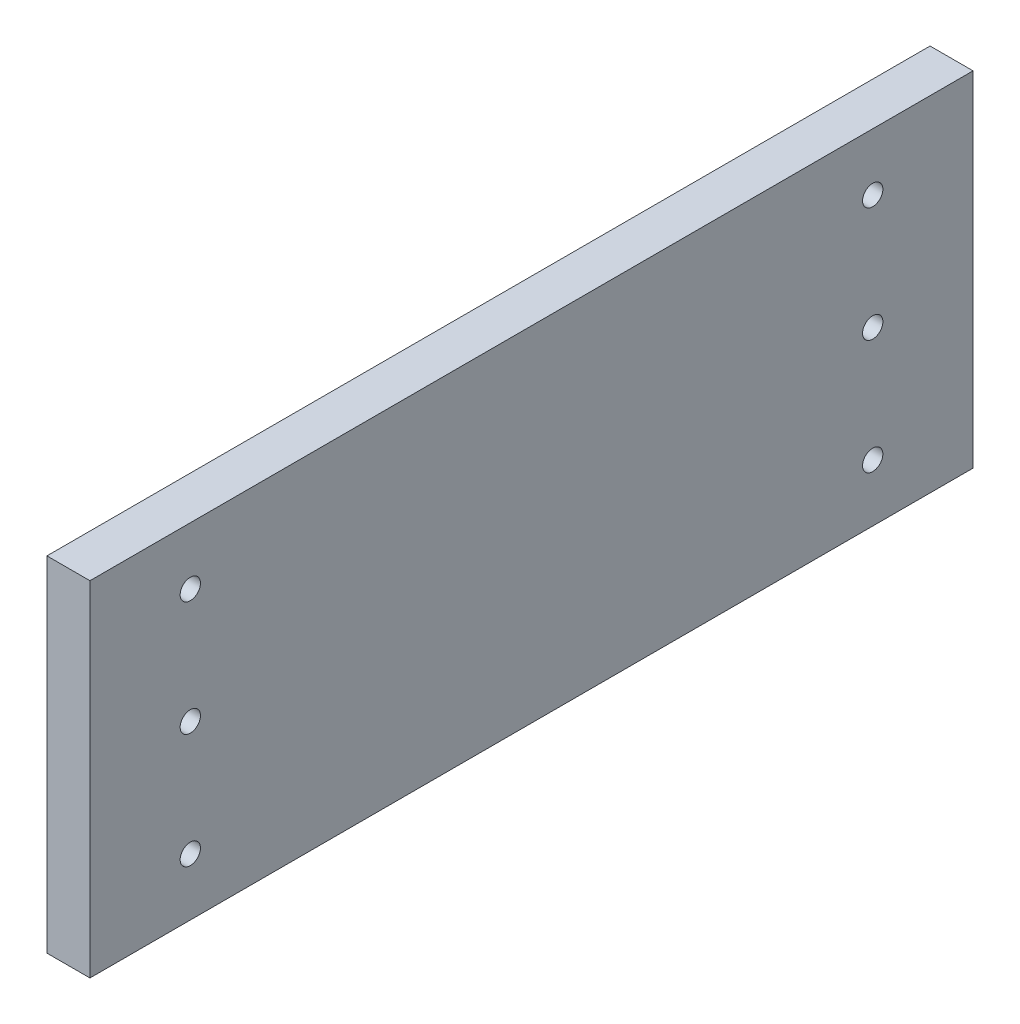
ISO-10303-21;
HEADER;
FILE_DESCRIPTION(('STEP AP214'),'2;1');
FILE_NAME('part.step','',(''),(''),'','','');
FILE_SCHEMA(('AUTOMOTIVE_DESIGN { 1 0 10303 214 1 1 1 1 }'));
ENDSEC;
DATA;
#1=APPLICATION_CONTEXT('core data for automotive mechanical design processes');
#2=APPLICATION_PROTOCOL_DEFINITION('international standard','automotive_design',2000,#1);
#3=PRODUCT_CONTEXT('',#1,'mechanical');
#4=PRODUCT('Part','Part','',(#3));
#5=PRODUCT_RELATED_PRODUCT_CATEGORY('part','',(#4));
#6=PRODUCT_DEFINITION_FORMATION('','',#4);
#7=PRODUCT_DEFINITION_CONTEXT('part definition',#1,'design');
#8=PRODUCT_DEFINITION('design','',#6,#7);
#9=PRODUCT_DEFINITION_SHAPE('','',#8);
#10=(LENGTH_UNIT() NAMED_UNIT(*) SI_UNIT(.MILLI.,.METRE.));
#11=(NAMED_UNIT(*) PLANE_ANGLE_UNIT() SI_UNIT($,.RADIAN.));
#12=(NAMED_UNIT(*) SI_UNIT($,.STERADIAN.) SOLID_ANGLE_UNIT());
#13=UNCERTAINTY_MEASURE_WITH_UNIT(LENGTH_MEASURE(1.E-05),#10,'distance_accuracy_value','');
#14=(GEOMETRIC_REPRESENTATION_CONTEXT(3) GLOBAL_UNCERTAINTY_ASSIGNED_CONTEXT((#13)) GLOBAL_UNIT_ASSIGNED_CONTEXT((#10,
#11,#12)) REPRESENTATION_CONTEXT('',''));
#15=CARTESIAN_POINT('',(0.,0.,0.));
#16=DIRECTION('',(0.,0.,1.));
#17=DIRECTION('',(1.,0.,0.));
#18=AXIS2_PLACEMENT_3D('',#15,#16,#17);
#19=CARTESIAN_POINT('',(4.7625,38.1,195.58));
#20=DIRECTION('',(-1.,0.,0.));
#21=DIRECTION('',(0.,-1.,0.));
#22=AXIS2_PLACEMENT_3D('',#19,#20,#21);
#23=PLANE('',#22);
#24=CARTESIAN_POINT('',(4.7625,25.4,173.355));
#25=DIRECTION('',(1.,0.,0.));
#26=DIRECTION('',(0.,0.,-1.));
#27=AXIS2_PLACEMENT_3D('',#24,#25,#26);
#28=CIRCLE('',#27,2.24789999999999);
#29=CARTESIAN_POINT('',(4.7625,25.4,171.1071));
#30=VERTEX_POINT('',#29);
#31=EDGE_CURVE('E142',#30,#30,#28,.T.);
#32=ORIENTED_EDGE('',*,*,#31,.F.);
#33=EDGE_LOOP('',(#32));
#34=FACE_BOUND('',#33,.T.);
#35=CARTESIAN_POINT('',(4.7625,0.,173.355));
#36=DIRECTION('',(1.,0.,0.));
#37=DIRECTION('',(0.,0.,-1.));
#38=AXIS2_PLACEMENT_3D('',#35,#36,#37);
#39=CIRCLE('',#38,2.24789999999999);
#40=CARTESIAN_POINT('',(4.7625,0.,171.1071));
#41=VERTEX_POINT('',#40);
#42=EDGE_CURVE('E136',#41,#41,#39,.T.);
#43=ORIENTED_EDGE('',*,*,#42,.F.);
#44=EDGE_LOOP('',(#43));
#45=FACE_BOUND('',#44,.T.);
#46=CARTESIAN_POINT('',(4.7625,-25.4,173.355));
#47=DIRECTION('',(1.,0.,0.));
#48=DIRECTION('',(0.,0.,-1.));
#49=AXIS2_PLACEMENT_3D('',#46,#47,#48);
#50=CIRCLE('',#49,2.24789999999999);
#51=CARTESIAN_POINT('',(4.7625,-25.4,171.1071));
#52=VERTEX_POINT('',#51);
#53=EDGE_CURVE('E130',#52,#52,#50,.T.);
#54=ORIENTED_EDGE('',*,*,#53,.F.);
#55=EDGE_LOOP('',(#54));
#56=FACE_BOUND('',#55,.T.);
#57=CARTESIAN_POINT('',(4.7625,25.4,22.225));
#58=DIRECTION('',(1.,0.,0.));
#59=DIRECTION('',(0.,0.,-1.));
#60=AXIS2_PLACEMENT_3D('',#57,#58,#59);
#61=CIRCLE('',#60,2.24789999999999);
#62=CARTESIAN_POINT('',(4.7625,25.4,19.9771));
#63=VERTEX_POINT('',#62);
#64=EDGE_CURVE('E124',#63,#63,#61,.T.);
#65=ORIENTED_EDGE('',*,*,#64,.F.);
#66=EDGE_LOOP('',(#65));
#67=FACE_BOUND('',#66,.T.);
#68=CARTESIAN_POINT('',(4.7625,0.,22.225));
#69=DIRECTION('',(1.,0.,0.));
#70=DIRECTION('',(0.,0.,-1.));
#71=AXIS2_PLACEMENT_3D('',#68,#69,#70);
#72=CIRCLE('',#71,2.24789999999999);
#73=CARTESIAN_POINT('',(4.7625,0.,19.9771));
#74=VERTEX_POINT('',#73);
#75=EDGE_CURVE('E118',#74,#74,#72,.T.);
#76=ORIENTED_EDGE('',*,*,#75,.F.);
#77=EDGE_LOOP('',(#76));
#78=FACE_BOUND('',#77,.T.);
#79=CARTESIAN_POINT('',(4.7625,-25.4,22.225));
#80=DIRECTION('',(1.,0.,0.));
#81=DIRECTION('',(0.,0.,-1.));
#82=AXIS2_PLACEMENT_3D('',#79,#80,#81);
#83=CIRCLE('',#82,2.24789999999999);
#84=CARTESIAN_POINT('',(4.7625,-25.4,19.9771));
#85=VERTEX_POINT('',#84);
#86=EDGE_CURVE('E112',#85,#85,#83,.T.);
#87=ORIENTED_EDGE('',*,*,#86,.F.);
#88=EDGE_LOOP('',(#87));
#89=FACE_BOUND('',#88,.T.);
#90=DIRECTION('',(0.,1.,0.));
#91=VECTOR('',#90,1.);
#92=CARTESIAN_POINT('',(4.7625,38.1,0.));
#93=LINE('',#92,#91);
#94=CARTESIAN_POINT('',(4.7625,-38.1,0.));
#95=VERTEX_POINT('',#94);
#96=CARTESIAN_POINT('',(4.7625,38.1,0.));
#97=VERTEX_POINT('',#96);
#98=EDGE_CURVE('E96',#95,#97,#93,.T.);
#99=ORIENTED_EDGE('',*,*,#98,.T.);
#100=DIRECTION('',(0.,0.,-1.));
#101=VECTOR('',#100,1.);
#102=CARTESIAN_POINT('',(4.7625,38.1,195.58));
#103=LINE('',#102,#101);
#104=CARTESIAN_POINT('',(4.7625,38.1,195.58));
#105=VERTEX_POINT('',#104);
#106=EDGE_CURVE('E11',#105,#97,#103,.T.);
#107=ORIENTED_EDGE('',*,*,#106,.F.);
#108=DIRECTION('',(0.,1.,0.));
#109=VECTOR('',#108,1.);
#110=CARTESIAN_POINT('',(4.7625,38.1,195.58));
#111=LINE('',#110,#109);
#112=CARTESIAN_POINT('',(4.7625,-38.1,195.58));
#113=VERTEX_POINT('',#112);
#114=EDGE_CURVE('E84',#113,#105,#111,.T.);
#115=ORIENTED_EDGE('',*,*,#114,.F.);
#116=DIRECTION('',(0.,0.,-1.));
#117=VECTOR('',#116,1.);
#118=CARTESIAN_POINT('',(4.7625,-38.1,195.58));
#119=LINE('',#118,#117);
#120=EDGE_CURVE('E92',#113,#95,#119,.T.);
#121=ORIENTED_EDGE('',*,*,#120,.T.);
#122=EDGE_LOOP('',(#99,#107,#115,#121));
#123=FACE_BOUND('',#122,.T.);
#124=ADVANCED_FACE('F33',(#34,#45,#56,#67,#78,#89,#123),#23,.F.);
#125=CARTESIAN_POINT('',(-4.7625,38.1,195.58));
#126=DIRECTION('',(0.,-1.,0.));
#127=DIRECTION('',(0.,0.,-1.));
#128=AXIS2_PLACEMENT_3D('',#125,#126,#127);
#129=PLANE('',#128);
#130=DIRECTION('',(-1.,0.,0.));
#131=VECTOR('',#130,1.);
#132=CARTESIAN_POINT('',(-4.7625,38.1,0.));
#133=LINE('',#132,#131);
#134=CARTESIAN_POINT('',(-4.7625,38.1,0.));
#135=VERTEX_POINT('',#134);
#136=EDGE_CURVE('E88',#97,#135,#133,.T.);
#137=ORIENTED_EDGE('',*,*,#136,.T.);
#138=DIRECTION('',(0.,0.,-1.));
#139=VECTOR('',#138,1.);
#140=CARTESIAN_POINT('',(-4.7625,38.1,195.58));
#141=LINE('',#140,#139);
#142=CARTESIAN_POINT('',(-4.7625,38.1,195.58));
#143=VERTEX_POINT('',#142);
#144=EDGE_CURVE('E41',#143,#135,#141,.T.);
#145=ORIENTED_EDGE('',*,*,#144,.F.);
#146=DIRECTION('',(-1.,0.,0.));
#147=VECTOR('',#146,1.);
#148=CARTESIAN_POINT('',(-4.7625,38.1,195.58));
#149=LINE('',#148,#147);
#150=EDGE_CURVE('E79',#105,#143,#149,.T.);
#151=ORIENTED_EDGE('',*,*,#150,.F.);
#152=ORIENTED_EDGE('',*,*,#106,.T.);
#153=EDGE_LOOP('',(#137,#145,#151,#152));
#154=FACE_BOUND('',#153,.T.);
#155=ADVANCED_FACE('F87',(#154),#129,.F.);
#156=CARTESIAN_POINT('',(-4.7625,38.1,195.58));
#157=DIRECTION('',(1.,0.,0.));
#158=DIRECTION('',(0.,1.,0.));
#159=AXIS2_PLACEMENT_3D('',#156,#157,#158);
#160=PLANE('',#159);
#161=CARTESIAN_POINT('',(-4.76250000000001,25.4,173.355));
#162=DIRECTION('',(1.,0.,0.));
#163=DIRECTION('',(0.,0.,-1.));
#164=AXIS2_PLACEMENT_3D('',#161,#162,#163);
#165=CIRCLE('',#164,2.2479);
#166=CARTESIAN_POINT('',(-4.76250000000001,25.4,171.1071));
#167=VERTEX_POINT('',#166);
#168=EDGE_CURVE('E139',#167,#167,#165,.T.);
#169=ORIENTED_EDGE('',*,*,#168,.T.);
#170=EDGE_LOOP('',(#169));
#171=FACE_BOUND('',#170,.T.);
#172=CARTESIAN_POINT('',(-4.76250000000001,0.,173.355));
#173=DIRECTION('',(1.,0.,0.));
#174=DIRECTION('',(0.,0.,-1.));
#175=AXIS2_PLACEMENT_3D('',#172,#173,#174);
#176=CIRCLE('',#175,2.2479);
#177=CARTESIAN_POINT('',(-4.76250000000001,0.,171.1071));
#178=VERTEX_POINT('',#177);
#179=EDGE_CURVE('E133',#178,#178,#176,.T.);
#180=ORIENTED_EDGE('',*,*,#179,.T.);
#181=EDGE_LOOP('',(#180));
#182=FACE_BOUND('',#181,.T.);
#183=CARTESIAN_POINT('',(-4.76250000000001,-25.4,173.355));
#184=DIRECTION('',(1.,0.,0.));
#185=DIRECTION('',(0.,0.,-1.));
#186=AXIS2_PLACEMENT_3D('',#183,#184,#185);
#187=CIRCLE('',#186,2.2479);
#188=CARTESIAN_POINT('',(-4.76250000000001,-25.4,171.1071));
#189=VERTEX_POINT('',#188);
#190=EDGE_CURVE('E127',#189,#189,#187,.T.);
#191=ORIENTED_EDGE('',*,*,#190,.T.);
#192=EDGE_LOOP('',(#191));
#193=FACE_BOUND('',#192,.T.);
#194=CARTESIAN_POINT('',(-4.76250000000001,25.4,22.225));
#195=DIRECTION('',(1.,0.,0.));
#196=DIRECTION('',(0.,0.,-1.));
#197=AXIS2_PLACEMENT_3D('',#194,#195,#196);
#198=CIRCLE('',#197,2.2479);
#199=CARTESIAN_POINT('',(-4.76250000000001,25.4,19.9771));
#200=VERTEX_POINT('',#199);
#201=EDGE_CURVE('E121',#200,#200,#198,.T.);
#202=ORIENTED_EDGE('',*,*,#201,.T.);
#203=EDGE_LOOP('',(#202));
#204=FACE_BOUND('',#203,.T.);
#205=CARTESIAN_POINT('',(-4.76250000000001,0.,22.225));
#206=DIRECTION('',(1.,0.,0.));
#207=DIRECTION('',(0.,0.,-1.));
#208=AXIS2_PLACEMENT_3D('',#205,#206,#207);
#209=CIRCLE('',#208,2.2479);
#210=CARTESIAN_POINT('',(-4.76250000000001,0.,19.9771));
#211=VERTEX_POINT('',#210);
#212=EDGE_CURVE('E115',#211,#211,#209,.T.);
#213=ORIENTED_EDGE('',*,*,#212,.T.);
#214=EDGE_LOOP('',(#213));
#215=FACE_BOUND('',#214,.T.);
#216=CARTESIAN_POINT('',(-4.76250000000001,-25.4,22.225));
#217=DIRECTION('',(1.,0.,0.));
#218=DIRECTION('',(0.,0.,-1.));
#219=AXIS2_PLACEMENT_3D('',#216,#217,#218);
#220=CIRCLE('',#219,2.2479);
#221=CARTESIAN_POINT('',(-4.76250000000001,-25.4,19.9771));
#222=VERTEX_POINT('',#221);
#223=EDGE_CURVE('E99',#222,#222,#220,.T.);
#224=ORIENTED_EDGE('',*,*,#223,.T.);
#225=EDGE_LOOP('',(#224));
#226=FACE_BOUND('',#225,.T.);
#227=DIRECTION('',(0.,-1.,0.));
#228=VECTOR('',#227,1.);
#229=CARTESIAN_POINT('',(-4.7625,38.1,0.));
#230=LINE('',#229,#228);
#231=CARTESIAN_POINT('',(-4.76249999999999,-38.1,0.));
#232=VERTEX_POINT('',#231);
#233=EDGE_CURVE('E66',#135,#232,#230,.T.);
#234=ORIENTED_EDGE('',*,*,#233,.T.);
#235=DIRECTION('',(0.,0.,-1.));
#236=VECTOR('',#235,1.);
#237=CARTESIAN_POINT('',(-4.76249999999999,-38.1,195.58));
#238=LINE('',#237,#236);
#239=CARTESIAN_POINT('',(-4.76249999999999,-38.1,195.58));
#240=VERTEX_POINT('',#239);
#241=EDGE_CURVE('E89',#240,#232,#238,.T.);
#242=ORIENTED_EDGE('',*,*,#241,.F.);
#243=DIRECTION('',(0.,-1.,0.));
#244=VECTOR('',#243,1.);
#245=CARTESIAN_POINT('',(-4.7625,38.1,195.58));
#246=LINE('',#245,#244);
#247=EDGE_CURVE('E82',#143,#240,#246,.T.);
#248=ORIENTED_EDGE('',*,*,#247,.F.);
#249=ORIENTED_EDGE('',*,*,#144,.T.);
#250=EDGE_LOOP('',(#234,#242,#248,#249));
#251=FACE_BOUND('',#250,.T.);
#252=ADVANCED_FACE('F90',(#171,#182,#193,#204,#215,#226,#251),#160,.F.);
#253=CARTESIAN_POINT('',(-4.76249999999999,-38.1,195.58));
#254=DIRECTION('',(0.,1.,0.));
#255=DIRECTION('',(0.,0.,1.));
#256=AXIS2_PLACEMENT_3D('',#253,#254,#255);
#257=PLANE('',#256);
#258=DIRECTION('',(1.,0.,0.));
#259=VECTOR('',#258,1.);
#260=CARTESIAN_POINT('',(-4.76249999999999,-38.1,0.));
#261=LINE('',#260,#259);
#262=EDGE_CURVE('E72',#232,#95,#261,.T.);
#263=ORIENTED_EDGE('',*,*,#262,.T.);
#264=ORIENTED_EDGE('',*,*,#120,.F.);
#265=DIRECTION('',(1.,0.,0.));
#266=VECTOR('',#265,1.);
#267=CARTESIAN_POINT('',(-4.76249999999999,-38.1,195.58));
#268=LINE('',#267,#266);
#269=EDGE_CURVE('E49',#240,#113,#268,.T.);
#270=ORIENTED_EDGE('',*,*,#269,.F.);
#271=ORIENTED_EDGE('',*,*,#241,.T.);
#272=EDGE_LOOP('',(#263,#264,#270,#271));
#273=FACE_BOUND('',#272,.T.);
#274=ADVANCED_FACE('F104',(#273),#257,.F.);
#275=CARTESIAN_POINT('',(0.,0.,195.58));
#276=DIRECTION('',(0.,0.,1.));
#277=DIRECTION('',(1.,0.,0.));
#278=AXIS2_PLACEMENT_3D('',#275,#276,#277);
#279=PLANE('',#278);
#280=ORIENTED_EDGE('',*,*,#114,.T.);
#281=ORIENTED_EDGE('',*,*,#150,.T.);
#282=ORIENTED_EDGE('',*,*,#247,.T.);
#283=ORIENTED_EDGE('',*,*,#269,.T.);
#284=EDGE_LOOP('',(#280,#281,#282,#283));
#285=FACE_BOUND('',#284,.T.);
#286=ADVANCED_FACE('F80',(#285),#279,.T.);
#287=CARTESIAN_POINT('',(0.,0.,0.));
#288=DIRECTION('',(0.,0.,1.));
#289=DIRECTION('',(1.,0.,0.));
#290=AXIS2_PLACEMENT_3D('',#287,#288,#289);
#291=PLANE('',#290);
#292=ORIENTED_EDGE('',*,*,#98,.F.);
#293=ORIENTED_EDGE('',*,*,#262,.F.);
#294=ORIENTED_EDGE('',*,*,#233,.F.);
#295=ORIENTED_EDGE('',*,*,#136,.F.);
#296=EDGE_LOOP('',(#292,#293,#294,#295));
#297=FACE_BOUND('',#296,.T.);
#298=ADVANCED_FACE('F107',(#297),#291,.F.);
#299=CARTESIAN_POINT('',(4.7625,-25.4,22.225));
#300=DIRECTION('',(1.,0.,0.));
#301=DIRECTION('',(0.,0.,-1.));
#302=AXIS2_PLACEMENT_3D('',#299,#300,#301);
#303=CYLINDRICAL_SURFACE('',#302,2.24789999999999);
#304=ORIENTED_EDGE('',*,*,#223,.F.);
#305=EDGE_LOOP('',(#304));
#306=FACE_BOUND('',#305,.T.);
#307=ORIENTED_EDGE('',*,*,#86,.T.);
#308=EDGE_LOOP('',(#307));
#309=FACE_BOUND('',#308,.T.);
#310=ADVANCED_FACE('F160',(#306,#309),#303,.F.);
#311=CARTESIAN_POINT('',(4.7625,0.,22.225));
#312=DIRECTION('',(1.,0.,0.));
#313=DIRECTION('',(0.,0.,-1.));
#314=AXIS2_PLACEMENT_3D('',#311,#312,#313);
#315=CYLINDRICAL_SURFACE('',#314,2.24789999999999);
#316=ORIENTED_EDGE('',*,*,#212,.F.);
#317=EDGE_LOOP('',(#316));
#318=FACE_BOUND('',#317,.T.);
#319=ORIENTED_EDGE('',*,*,#75,.T.);
#320=EDGE_LOOP('',(#319));
#321=FACE_BOUND('',#320,.T.);
#322=ADVANCED_FACE('F162',(#318,#321),#315,.F.);
#323=CARTESIAN_POINT('',(4.7625,25.4,22.225));
#324=DIRECTION('',(1.,0.,0.));
#325=DIRECTION('',(0.,0.,-1.));
#326=AXIS2_PLACEMENT_3D('',#323,#324,#325);
#327=CYLINDRICAL_SURFACE('',#326,2.24789999999999);
#328=ORIENTED_EDGE('',*,*,#201,.F.);
#329=EDGE_LOOP('',(#328));
#330=FACE_BOUND('',#329,.T.);
#331=ORIENTED_EDGE('',*,*,#64,.T.);
#332=EDGE_LOOP('',(#331));
#333=FACE_BOUND('',#332,.T.);
#334=ADVANCED_FACE('F169',(#330,#333),#327,.F.);
#335=CARTESIAN_POINT('',(4.7625,-25.4,173.355));
#336=DIRECTION('',(1.,0.,0.));
#337=DIRECTION('',(0.,0.,-1.));
#338=AXIS2_PLACEMENT_3D('',#335,#336,#337);
#339=CYLINDRICAL_SURFACE('',#338,2.24789999999999);
#340=ORIENTED_EDGE('',*,*,#190,.F.);
#341=EDGE_LOOP('',(#340));
#342=FACE_BOUND('',#341,.T.);
#343=ORIENTED_EDGE('',*,*,#53,.T.);
#344=EDGE_LOOP('',(#343));
#345=FACE_BOUND('',#344,.T.);
#346=ADVANCED_FACE('F234',(#342,#345),#339,.F.);
#347=CARTESIAN_POINT('',(4.7625,0.,173.355));
#348=DIRECTION('',(1.,0.,0.));
#349=DIRECTION('',(0.,0.,-1.));
#350=AXIS2_PLACEMENT_3D('',#347,#348,#349);
#351=CYLINDRICAL_SURFACE('',#350,2.24789999999999);
#352=ORIENTED_EDGE('',*,*,#179,.F.);
#353=EDGE_LOOP('',(#352));
#354=FACE_BOUND('',#353,.T.);
#355=ORIENTED_EDGE('',*,*,#42,.T.);
#356=EDGE_LOOP('',(#355));
#357=FACE_BOUND('',#356,.T.);
#358=ADVANCED_FACE('F242',(#354,#357),#351,.F.);
#359=CARTESIAN_POINT('',(4.7625,25.4,173.355));
#360=DIRECTION('',(1.,0.,0.));
#361=DIRECTION('',(0.,0.,-1.));
#362=AXIS2_PLACEMENT_3D('',#359,#360,#361);
#363=CYLINDRICAL_SURFACE('',#362,2.24789999999999);
#364=ORIENTED_EDGE('',*,*,#168,.F.);
#365=EDGE_LOOP('',(#364));
#366=FACE_BOUND('',#365,.T.);
#367=ORIENTED_EDGE('',*,*,#31,.T.);
#368=EDGE_LOOP('',(#367));
#369=FACE_BOUND('',#368,.T.);
#370=ADVANCED_FACE('F146',(#366,#369),#363,.F.);
#371=CLOSED_SHELL('',(#124,#155,#252,#274,#286,#298,#310,#322,#334,#346,#358,#370));
#372=MANIFOLD_SOLID_BREP('B2',#371);
#373=ADVANCED_BREP_SHAPE_REPRESENTATION('',(#18,#372),#14);
#374=SHAPE_DEFINITION_REPRESENTATION(#9,#373);
ENDSEC;
END-ISO-10303-21;
